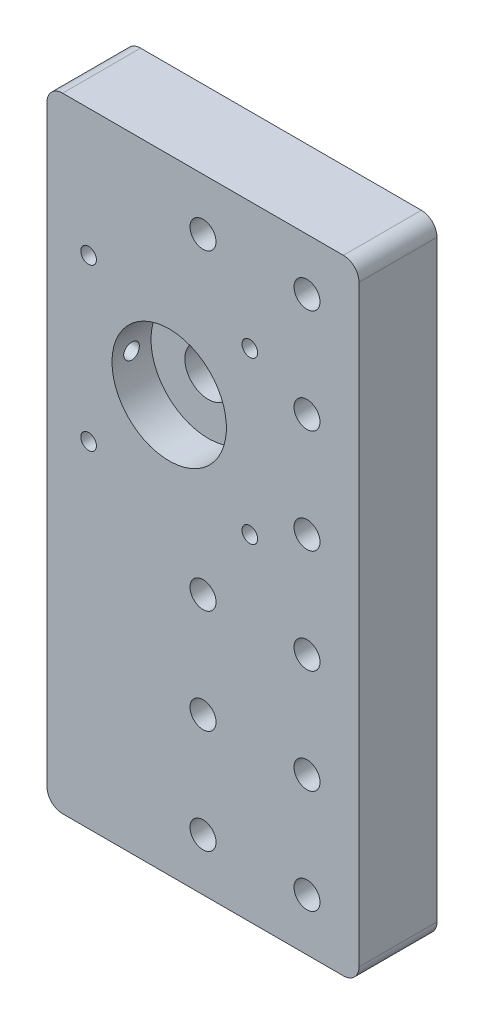
ISO-10303-21;
HEADER;
FILE_DESCRIPTION(('STEP AP214'),'2;1');
FILE_NAME('part.step','',(''),(''),'','','');
FILE_SCHEMA(('AUTOMOTIVE_DESIGN { 1 0 10303 214 1 1 1 1 }'));
ENDSEC;
DATA;
#1=APPLICATION_CONTEXT('core data for automotive mechanical design processes');
#2=APPLICATION_PROTOCOL_DEFINITION('international standard','automotive_design',2000,#1);
#3=PRODUCT_CONTEXT('',#1,'mechanical');
#4=PRODUCT('Part','Part','',(#3));
#5=PRODUCT_RELATED_PRODUCT_CATEGORY('part','',(#4));
#6=PRODUCT_DEFINITION_FORMATION('','',#4);
#7=PRODUCT_DEFINITION_CONTEXT('part definition',#1,'design');
#8=PRODUCT_DEFINITION('design','',#6,#7);
#9=PRODUCT_DEFINITION_SHAPE('','',#8);
#10=(LENGTH_UNIT() NAMED_UNIT(*) SI_UNIT(.MILLI.,.METRE.));
#11=(NAMED_UNIT(*) PLANE_ANGLE_UNIT() SI_UNIT($,.RADIAN.));
#12=(NAMED_UNIT(*) SI_UNIT($,.STERADIAN.) SOLID_ANGLE_UNIT());
#13=UNCERTAINTY_MEASURE_WITH_UNIT(LENGTH_MEASURE(1.E-05),#10,'distance_accuracy_value','');
#14=(GEOMETRIC_REPRESENTATION_CONTEXT(3) GLOBAL_UNCERTAINTY_ASSIGNED_CONTEXT((#13)) GLOBAL_UNIT_ASSIGNED_CONTEXT((#10,
#11,#12)) REPRESENTATION_CONTEXT('',''));
#15=CARTESIAN_POINT('',(0.,0.,0.));
#16=DIRECTION('',(0.,0.,1.));
#17=DIRECTION('',(1.,0.,0.));
#18=AXIS2_PLACEMENT_3D('',#15,#16,#17);
#19=CARTESIAN_POINT('',(83.5,80.,0.));
#20=DIRECTION('',(0.,0.,1.));
#21=DIRECTION('',(-1.,0.,0.));
#22=AXIS2_PLACEMENT_3D('',#19,#20,#21);
#23=CYLINDRICAL_SURFACE('',#22,4.5);
#24=CARTESIAN_POINT('',(83.5,80.,0.));
#25=DIRECTION('',(0.,0.,-1.));
#26=DIRECTION('',(-1.,0.,0.));
#27=AXIS2_PLACEMENT_3D('',#24,#25,#26);
#28=CIRCLE('',#27,4.5);
#29=CARTESIAN_POINT('',(79.,80.,0.));
#30=VERTEX_POINT('',#29);
#31=EDGE_CURVE('E286',#30,#30,#28,.T.);
#32=ORIENTED_EDGE('',*,*,#31,.T.);
#33=EDGE_LOOP('',(#32));
#34=FACE_BOUND('',#33,.T.);
#35=CARTESIAN_POINT('',(83.5,80.,7.5));
#36=DIRECTION('',(0.,0.,-1.));
#37=DIRECTION('',(-1.,0.,0.));
#38=AXIS2_PLACEMENT_3D('',#35,#36,#37);
#39=CIRCLE('',#38,4.5);
#40=CARTESIAN_POINT('',(79.,80.,7.5));
#41=VERTEX_POINT('',#40);
#42=EDGE_CURVE('E330',#41,#41,#39,.T.);
#43=ORIENTED_EDGE('',*,*,#42,.F.);
#44=EDGE_LOOP('',(#43));
#45=FACE_BOUND('',#44,.T.);
#46=ADVANCED_FACE('F39',(#34,#45),#23,.F.);
#47=CARTESIAN_POINT('',(120.,0.,15.));
#48=DIRECTION('',(0.,0.,-1.));
#49=DIRECTION('',(1.,0.,0.));
#50=AXIS2_PLACEMENT_3D('',#47,#48,#49);
#51=PLANE('',#50);
#52=CARTESIAN_POINT('',(83.5,80.,15.));
#53=DIRECTION('',(0.,0.,-1.));
#54=DIRECTION('',(-1.,0.,0.));
#55=AXIS2_PLACEMENT_3D('',#52,#53,#54);
#56=CIRCLE('',#55,11.);
#57=CARTESIAN_POINT('',(72.5,80.,15.));
#58=VERTEX_POINT('',#57);
#59=EDGE_CURVE('E326',#58,#58,#56,.T.);
#60=ORIENTED_EDGE('',*,*,#59,.T.);
#61=EDGE_LOOP('',(#60));
#62=FACE_BOUND('',#61,.T.);
#63=CARTESIAN_POINT('',(99.,64.5,15.));
#64=DIRECTION('',(0.,0.,-1.));
#65=DIRECTION('',(-1.,0.,0.));
#66=AXIS2_PLACEMENT_3D('',#63,#64,#65);
#67=CIRCLE('',#66,1.5);
#68=CARTESIAN_POINT('',(97.5,64.5,15.));
#69=VERTEX_POINT('',#68);
#70=EDGE_CURVE('E298',#69,#69,#67,.T.);
#71=ORIENTED_EDGE('',*,*,#70,.T.);
#72=EDGE_LOOP('',(#71));
#73=FACE_BOUND('',#72,.T.);
#74=CARTESIAN_POINT('',(68.,64.5,15.));
#75=DIRECTION('',(0.,0.,-1.));
#76=DIRECTION('',(-1.,0.,0.));
#77=AXIS2_PLACEMENT_3D('',#74,#75,#76);
#78=CIRCLE('',#77,1.5);
#79=CARTESIAN_POINT('',(66.5,64.5,15.));
#80=VERTEX_POINT('',#79);
#81=EDGE_CURVE('E307',#80,#80,#78,.T.);
#82=ORIENTED_EDGE('',*,*,#81,.T.);
#83=EDGE_LOOP('',(#82));
#84=FACE_BOUND('',#83,.T.);
#85=CARTESIAN_POINT('',(99.,95.5,15.));
#86=DIRECTION('',(0.,0.,-1.));
#87=DIRECTION('',(-1.,0.,0.));
#88=AXIS2_PLACEMENT_3D('',#85,#86,#87);
#89=CIRCLE('',#88,1.5);
#90=CARTESIAN_POINT('',(97.5,95.5,15.));
#91=VERTEX_POINT('',#90);
#92=EDGE_CURVE('E315',#91,#91,#89,.T.);
#93=ORIENTED_EDGE('',*,*,#92,.T.);
#94=EDGE_LOOP('',(#93));
#95=FACE_BOUND('',#94,.T.);
#96=CARTESIAN_POINT('',(68.,95.5,15.));
#97=DIRECTION('',(0.,0.,-1.));
#98=DIRECTION('',(-1.,0.,0.));
#99=AXIS2_PLACEMENT_3D('',#96,#97,#98);
#100=CIRCLE('',#99,1.5);
#101=CARTESIAN_POINT('',(66.5,95.5,15.));
#102=VERTEX_POINT('',#101);
#103=EDGE_CURVE('E293',#102,#102,#100,.T.);
#104=ORIENTED_EDGE('',*,*,#103,.T.);
#105=EDGE_LOOP('',(#104));
#106=FACE_BOUND('',#105,.T.);
#107=DIRECTION('',(0.,-1.,0.));
#108=VECTOR('',#107,1.);
#109=CARTESIAN_POINT('',(120.,0.,15.));
#110=LINE('',#109,#108);
#111=CARTESIAN_POINT('',(120.,117.,15.));
#112=VERTEX_POINT('',#111);
#113=CARTESIAN_POINT('',(120.,3.,15.));
#114=VERTEX_POINT('',#113);
#115=EDGE_CURVE('E148',#112,#114,#110,.T.);
#116=ORIENTED_EDGE('',*,*,#115,.F.);
#117=CARTESIAN_POINT('',(117.,117.,15.));
#118=DIRECTION('',(0.,0.,1.));
#119=DIRECTION('',(1.,0.,0.));
#120=AXIS2_PLACEMENT_3D('',#117,#118,#119);
#121=CIRCLE('',#120,3.);
#122=CARTESIAN_POINT('',(117.,120.,15.));
#123=VERTEX_POINT('',#122);
#124=EDGE_CURVE('E168',#123,#112,#121,.F.);
#125=ORIENTED_EDGE('',*,*,#124,.F.);
#126=DIRECTION('',(1.,0.,0.));
#127=VECTOR('',#126,1.);
#128=CARTESIAN_POINT('',(120.,120.,15.));
#129=LINE('',#128,#127);
#130=CARTESIAN_POINT('',(63.,120.,15.));
#131=VERTEX_POINT('',#130);
#132=EDGE_CURVE('E150',#131,#123,#129,.T.);
#133=ORIENTED_EDGE('',*,*,#132,.F.);
#134=CARTESIAN_POINT('',(63.,117.,15.));
#135=DIRECTION('',(0.,0.,1.));
#136=DIRECTION('',(1.,0.,0.));
#137=AXIS2_PLACEMENT_3D('',#134,#135,#136);
#138=CIRCLE('',#137,3.);
#139=CARTESIAN_POINT('',(60.,117.,15.));
#140=VERTEX_POINT('',#139);
#141=EDGE_CURVE('E165',#140,#131,#138,.F.);
#142=ORIENTED_EDGE('',*,*,#141,.F.);
#143=DIRECTION('',(0.,1.,0.));
#144=VECTOR('',#143,1.);
#145=CARTESIAN_POINT('',(60.,0.,15.));
#146=LINE('',#145,#144);
#147=CARTESIAN_POINT('',(60.,3.,15.));
#148=VERTEX_POINT('',#147);
#149=EDGE_CURVE('E193',#148,#140,#146,.T.);
#150=ORIENTED_EDGE('',*,*,#149,.F.);
#151=CARTESIAN_POINT('',(63.,3.,15.));
#152=DIRECTION('',(0.,0.,1.));
#153=DIRECTION('',(1.,0.,0.));
#154=AXIS2_PLACEMENT_3D('',#151,#152,#153);
#155=CIRCLE('',#154,3.);
#156=CARTESIAN_POINT('',(63.,0.,15.));
#157=VERTEX_POINT('',#156);
#158=EDGE_CURVE('E171',#157,#148,#155,.F.);
#159=ORIENTED_EDGE('',*,*,#158,.F.);
#160=DIRECTION('',(-1.,0.,0.));
#161=VECTOR('',#160,1.);
#162=CARTESIAN_POINT('',(120.,0.,15.));
#163=LINE('',#162,#161);
#164=CARTESIAN_POINT('',(117.,0.,15.));
#165=VERTEX_POINT('',#164);
#166=EDGE_CURVE('E197',#165,#157,#163,.T.);
#167=ORIENTED_EDGE('',*,*,#166,.F.);
#168=CARTESIAN_POINT('',(117.,3.,15.));
#169=DIRECTION('',(0.,0.,1.));
#170=DIRECTION('',(1.,0.,0.));
#171=AXIS2_PLACEMENT_3D('',#168,#169,#170);
#172=CIRCLE('',#171,3.);
#173=EDGE_CURVE('E109',#114,#165,#172,.F.);
#174=ORIENTED_EDGE('',*,*,#173,.F.);
#175=EDGE_LOOP('',(#116,#125,#133,#142,#150,#159,#167,#174));
#176=FACE_BOUND('',#175,.T.);
#177=CARTESIAN_POINT('',(110.,110.,15.));
#178=DIRECTION('',(0.,0.,-1.));
#179=DIRECTION('',(-1.,0.,0.));
#180=AXIS2_PLACEMENT_3D('',#177,#178,#179);
#181=CIRCLE('',#180,2.5);
#182=CARTESIAN_POINT('',(107.5,110.,15.));
#183=VERTEX_POINT('',#182);
#184=EDGE_CURVE('E141',#183,#183,#181,.T.);
#185=ORIENTED_EDGE('',*,*,#184,.T.);
#186=EDGE_LOOP('',(#185));
#187=FACE_BOUND('',#186,.T.);
#188=CARTESIAN_POINT('',(90.,110.,15.));
#189=DIRECTION('',(0.,0.,-1.));
#190=DIRECTION('',(-1.,0.,0.));
#191=AXIS2_PLACEMENT_3D('',#188,#189,#190);
#192=CIRCLE('',#191,2.5);
#193=CARTESIAN_POINT('',(87.5,110.,15.));
#194=VERTEX_POINT('',#193);
#195=EDGE_CURVE('E214',#194,#194,#192,.T.);
#196=ORIENTED_EDGE('',*,*,#195,.T.);
#197=EDGE_LOOP('',(#196));
#198=FACE_BOUND('',#197,.T.);
#199=CARTESIAN_POINT('',(110.,90.,15.));
#200=DIRECTION('',(0.,0.,-1.));
#201=DIRECTION('',(-1.,0.,0.));
#202=AXIS2_PLACEMENT_3D('',#199,#200,#201);
#203=CIRCLE('',#202,2.5);
#204=CARTESIAN_POINT('',(107.5,90.,15.));
#205=VERTEX_POINT('',#204);
#206=EDGE_CURVE('E222',#205,#205,#203,.T.);
#207=ORIENTED_EDGE('',*,*,#206,.T.);
#208=EDGE_LOOP('',(#207));
#209=FACE_BOUND('',#208,.T.);
#210=CARTESIAN_POINT('',(110.,70.,15.));
#211=DIRECTION('',(0.,0.,-1.));
#212=DIRECTION('',(-1.,0.,0.));
#213=AXIS2_PLACEMENT_3D('',#210,#211,#212);
#214=CIRCLE('',#213,2.5);
#215=CARTESIAN_POINT('',(107.5,70.,15.));
#216=VERTEX_POINT('',#215);
#217=EDGE_CURVE('E230',#216,#216,#214,.T.);
#218=ORIENTED_EDGE('',*,*,#217,.T.);
#219=EDGE_LOOP('',(#218));
#220=FACE_BOUND('',#219,.T.);
#221=CARTESIAN_POINT('',(110.,30.,15.));
#222=DIRECTION('',(0.,0.,-1.));
#223=DIRECTION('',(-1.,0.,0.));
#224=AXIS2_PLACEMENT_3D('',#221,#222,#223);
#225=CIRCLE('',#224,2.5);
#226=CARTESIAN_POINT('',(107.5,30.,15.));
#227=VERTEX_POINT('',#226);
#228=EDGE_CURVE('E238',#227,#227,#225,.T.);
#229=ORIENTED_EDGE('',*,*,#228,.T.);
#230=EDGE_LOOP('',(#229));
#231=FACE_BOUND('',#230,.T.);
#232=CARTESIAN_POINT('',(110.,10.,15.));
#233=DIRECTION('',(0.,0.,-1.));
#234=DIRECTION('',(-1.,0.,0.));
#235=AXIS2_PLACEMENT_3D('',#232,#233,#234);
#236=CIRCLE('',#235,2.5);
#237=CARTESIAN_POINT('',(107.5,10.,15.));
#238=VERTEX_POINT('',#237);
#239=EDGE_CURVE('E246',#238,#238,#236,.T.);
#240=ORIENTED_EDGE('',*,*,#239,.T.);
#241=EDGE_LOOP('',(#240));
#242=FACE_BOUND('',#241,.T.);
#243=CARTESIAN_POINT('',(90.,10.,15.));
#244=DIRECTION('',(0.,0.,-1.));
#245=DIRECTION('',(-1.,0.,0.));
#246=AXIS2_PLACEMENT_3D('',#243,#244,#245);
#247=CIRCLE('',#246,2.5);
#248=CARTESIAN_POINT('',(87.5,10.,15.));
#249=VERTEX_POINT('',#248);
#250=EDGE_CURVE('E254',#249,#249,#247,.T.);
#251=ORIENTED_EDGE('',*,*,#250,.T.);
#252=EDGE_LOOP('',(#251));
#253=FACE_BOUND('',#252,.T.);
#254=CARTESIAN_POINT('',(110.,50.,15.));
#255=DIRECTION('',(0.,0.,-1.));
#256=DIRECTION('',(-1.,0.,0.));
#257=AXIS2_PLACEMENT_3D('',#254,#255,#256);
#258=CIRCLE('',#257,2.5);
#259=CARTESIAN_POINT('',(107.5,50.,15.));
#260=VERTEX_POINT('',#259);
#261=EDGE_CURVE('E262',#260,#260,#258,.T.);
#262=ORIENTED_EDGE('',*,*,#261,.T.);
#263=EDGE_LOOP('',(#262));
#264=FACE_BOUND('',#263,.T.);
#265=CARTESIAN_POINT('',(90.,50.,15.));
#266=DIRECTION('',(0.,0.,-1.));
#267=DIRECTION('',(-1.,0.,0.));
#268=AXIS2_PLACEMENT_3D('',#265,#266,#267);
#269=CIRCLE('',#268,2.5);
#270=CARTESIAN_POINT('',(87.5,50.,15.));
#271=VERTEX_POINT('',#270);
#272=EDGE_CURVE('E270',#271,#271,#269,.T.);
#273=ORIENTED_EDGE('',*,*,#272,.T.);
#274=EDGE_LOOP('',(#273));
#275=FACE_BOUND('',#274,.T.);
#276=CARTESIAN_POINT('',(90.,30.,15.));
#277=DIRECTION('',(0.,0.,-1.));
#278=DIRECTION('',(-1.,0.,0.));
#279=AXIS2_PLACEMENT_3D('',#276,#277,#278);
#280=CIRCLE('',#279,2.5);
#281=CARTESIAN_POINT('',(87.5,30.,15.));
#282=VERTEX_POINT('',#281);
#283=EDGE_CURVE('E278',#282,#282,#280,.T.);
#284=ORIENTED_EDGE('',*,*,#283,.T.);
#285=EDGE_LOOP('',(#284));
#286=FACE_BOUND('',#285,.T.);
#287=ADVANCED_FACE('F200',(#62,#73,#84,#95,#106,#176,#187,#198,#209,#220,#231,#242,#253,#264,
#275,#286),#51,.F.);
#288=CARTESIAN_POINT('',(120.,0.,0.));
#289=DIRECTION('',(0.,0.,-1.));
#290=DIRECTION('',(1.,0.,0.));
#291=AXIS2_PLACEMENT_3D('',#288,#289,#290);
#292=PLANE('',#291);
#293=CARTESIAN_POINT('',(99.,64.5,0.));
#294=DIRECTION('',(0.,0.,-1.));
#295=DIRECTION('',(-1.,0.,0.));
#296=AXIS2_PLACEMENT_3D('',#293,#294,#295);
#297=CIRCLE('',#296,1.5);
#298=CARTESIAN_POINT('',(97.5,64.5,0.));
#299=VERTEX_POINT('',#298);
#300=EDGE_CURVE('E294',#299,#299,#297,.T.);
#301=ORIENTED_EDGE('',*,*,#300,.F.);
#302=EDGE_LOOP('',(#301));
#303=FACE_BOUND('',#302,.T.);
#304=CARTESIAN_POINT('',(68.,64.5,0.));
#305=DIRECTION('',(0.,0.,-1.));
#306=DIRECTION('',(-1.,0.,0.));
#307=AXIS2_PLACEMENT_3D('',#304,#305,#306);
#308=CIRCLE('',#307,1.5);
#309=CARTESIAN_POINT('',(66.5,64.5,0.));
#310=VERTEX_POINT('',#309);
#311=EDGE_CURVE('E303',#310,#310,#308,.T.);
#312=ORIENTED_EDGE('',*,*,#311,.F.);
#313=EDGE_LOOP('',(#312));
#314=FACE_BOUND('',#313,.T.);
#315=CARTESIAN_POINT('',(99.,95.5,0.));
#316=DIRECTION('',(0.,0.,-1.));
#317=DIRECTION('',(-1.,0.,0.));
#318=AXIS2_PLACEMENT_3D('',#315,#316,#317);
#319=CIRCLE('',#318,1.5);
#320=CARTESIAN_POINT('',(97.5,95.5,0.));
#321=VERTEX_POINT('',#320);
#322=EDGE_CURVE('E311',#321,#321,#319,.T.);
#323=ORIENTED_EDGE('',*,*,#322,.F.);
#324=EDGE_LOOP('',(#323));
#325=FACE_BOUND('',#324,.T.);
#326=CARTESIAN_POINT('',(68.,95.5,0.));
#327=DIRECTION('',(0.,0.,-1.));
#328=DIRECTION('',(-1.,0.,0.));
#329=AXIS2_PLACEMENT_3D('',#326,#327,#328);
#330=CIRCLE('',#329,1.5);
#331=CARTESIAN_POINT('',(66.5,95.5,0.));
#332=VERTEX_POINT('',#331);
#333=EDGE_CURVE('E319',#332,#332,#330,.T.);
#334=ORIENTED_EDGE('',*,*,#333,.F.);
#335=EDGE_LOOP('',(#334));
#336=FACE_BOUND('',#335,.T.);
#337=ORIENTED_EDGE('',*,*,#31,.F.);
#338=EDGE_LOOP('',(#337));
#339=FACE_BOUND('',#338,.T.);
#340=CARTESIAN_POINT('',(90.,50.,0.));
#341=DIRECTION('',(0.,0.,-1.));
#342=DIRECTION('',(-1.,0.,0.));
#343=AXIS2_PLACEMENT_3D('',#340,#341,#342);
#344=CIRCLE('',#343,2.5);
#345=CARTESIAN_POINT('',(87.5,50.,0.));
#346=VERTEX_POINT('',#345);
#347=EDGE_CURVE('E274',#346,#346,#344,.T.);
#348=ORIENTED_EDGE('',*,*,#347,.F.);
#349=EDGE_LOOP('',(#348));
#350=FACE_BOUND('',#349,.T.);
#351=CARTESIAN_POINT('',(90.,10.,0.));
#352=DIRECTION('',(0.,0.,-1.));
#353=DIRECTION('',(-1.,0.,0.));
#354=AXIS2_PLACEMENT_3D('',#351,#352,#353);
#355=CIRCLE('',#354,2.5);
#356=CARTESIAN_POINT('',(87.5,10.,0.));
#357=VERTEX_POINT('',#356);
#358=EDGE_CURVE('E258',#357,#357,#355,.T.);
#359=ORIENTED_EDGE('',*,*,#358,.F.);
#360=EDGE_LOOP('',(#359));
#361=FACE_BOUND('',#360,.T.);
#362=CARTESIAN_POINT('',(110.,30.,0.));
#363=DIRECTION('',(0.,0.,-1.));
#364=DIRECTION('',(-1.,0.,0.));
#365=AXIS2_PLACEMENT_3D('',#362,#363,#364);
#366=CIRCLE('',#365,2.5);
#367=CARTESIAN_POINT('',(107.5,30.,0.));
#368=VERTEX_POINT('',#367);
#369=EDGE_CURVE('E242',#368,#368,#366,.T.);
#370=ORIENTED_EDGE('',*,*,#369,.F.);
#371=EDGE_LOOP('',(#370));
#372=FACE_BOUND('',#371,.T.);
#373=CARTESIAN_POINT('',(110.,90.,0.));
#374=DIRECTION('',(0.,0.,-1.));
#375=DIRECTION('',(-1.,0.,0.));
#376=AXIS2_PLACEMENT_3D('',#373,#374,#375);
#377=CIRCLE('',#376,2.5);
#378=CARTESIAN_POINT('',(107.5,90.,0.));
#379=VERTEX_POINT('',#378);
#380=EDGE_CURVE('E226',#379,#379,#377,.T.);
#381=ORIENTED_EDGE('',*,*,#380,.F.);
#382=EDGE_LOOP('',(#381));
#383=FACE_BOUND('',#382,.T.);
#384=CARTESIAN_POINT('',(110.,110.,0.));
#385=DIRECTION('',(0.,0.,-1.));
#386=DIRECTION('',(-1.,0.,0.));
#387=AXIS2_PLACEMENT_3D('',#384,#385,#386);
#388=CIRCLE('',#387,2.5);
#389=CARTESIAN_POINT('',(107.5,110.,0.));
#390=VERTEX_POINT('',#389);
#391=EDGE_CURVE('E210',#390,#390,#388,.T.);
#392=ORIENTED_EDGE('',*,*,#391,.F.);
#393=EDGE_LOOP('',(#392));
#394=FACE_BOUND('',#393,.T.);
#395=DIRECTION('',(-1.,0.,0.));
#396=VECTOR('',#395,1.);
#397=CARTESIAN_POINT('',(120.,0.,0.));
#398=LINE('',#397,#396);
#399=CARTESIAN_POINT('',(117.,0.,0.));
#400=VERTEX_POINT('',#399);
#401=CARTESIAN_POINT('',(63.,0.,0.));
#402=VERTEX_POINT('',#401);
#403=EDGE_CURVE('E123',#400,#402,#398,.T.);
#404=ORIENTED_EDGE('',*,*,#403,.T.);
#405=CARTESIAN_POINT('',(63.,3.,0.));
#406=DIRECTION('',(0.,0.,1.));
#407=DIRECTION('',(1.,0.,0.));
#408=AXIS2_PLACEMENT_3D('',#405,#406,#407);
#409=CIRCLE('',#408,3.);
#410=CARTESIAN_POINT('',(60.,3.,0.));
#411=VERTEX_POINT('',#410);
#412=EDGE_CURVE('E129',#411,#402,#409,.T.);
#413=ORIENTED_EDGE('',*,*,#412,.F.);
#414=DIRECTION('',(0.,1.,0.));
#415=VECTOR('',#414,1.);
#416=CARTESIAN_POINT('',(60.,0.,0.));
#417=LINE('',#416,#415);
#418=CARTESIAN_POINT('',(60.,117.,0.));
#419=VERTEX_POINT('',#418);
#420=EDGE_CURVE('E134',#411,#419,#417,.T.);
#421=ORIENTED_EDGE('',*,*,#420,.T.);
#422=CARTESIAN_POINT('',(63.,117.,0.));
#423=DIRECTION('',(0.,0.,1.));
#424=DIRECTION('',(1.,0.,0.));
#425=AXIS2_PLACEMENT_3D('',#422,#423,#424);
#426=CIRCLE('',#425,3.);
#427=CARTESIAN_POINT('',(63.,120.,0.));
#428=VERTEX_POINT('',#427);
#429=EDGE_CURVE('E115',#428,#419,#426,.T.);
#430=ORIENTED_EDGE('',*,*,#429,.F.);
#431=DIRECTION('',(1.,0.,0.));
#432=VECTOR('',#431,1.);
#433=CARTESIAN_POINT('',(120.,120.,0.));
#434=LINE('',#433,#432);
#435=CARTESIAN_POINT('',(117.,120.,0.));
#436=VERTEX_POINT('',#435);
#437=EDGE_CURVE('E139',#428,#436,#434,.T.);
#438=ORIENTED_EDGE('',*,*,#437,.T.);
#439=CARTESIAN_POINT('',(117.,117.,0.));
#440=DIRECTION('',(0.,0.,1.));
#441=DIRECTION('',(1.,0.,0.));
#442=AXIS2_PLACEMENT_3D('',#439,#440,#441);
#443=CIRCLE('',#442,3.);
#444=CARTESIAN_POINT('',(120.,117.,0.));
#445=VERTEX_POINT('',#444);
#446=EDGE_CURVE('E155',#445,#436,#443,.T.);
#447=ORIENTED_EDGE('',*,*,#446,.F.);
#448=DIRECTION('',(0.,-1.,0.));
#449=VECTOR('',#448,1.);
#450=CARTESIAN_POINT('',(120.,0.,0.));
#451=LINE('',#450,#449);
#452=CARTESIAN_POINT('',(120.,3.,0.));
#453=VERTEX_POINT('',#452);
#454=EDGE_CURVE('E126',#445,#453,#451,.T.);
#455=ORIENTED_EDGE('',*,*,#454,.T.);
#456=CARTESIAN_POINT('',(117.,3.,0.));
#457=DIRECTION('',(0.,0.,1.));
#458=DIRECTION('',(1.,0.,0.));
#459=AXIS2_PLACEMENT_3D('',#456,#457,#458);
#460=CIRCLE('',#459,3.);
#461=EDGE_CURVE('E106',#400,#453,#460,.T.);
#462=ORIENTED_EDGE('',*,*,#461,.F.);
#463=EDGE_LOOP('',(#404,#413,#421,#430,#438,#447,#455,#462));
#464=FACE_BOUND('',#463,.T.);
#465=CARTESIAN_POINT('',(90.,110.,0.));
#466=DIRECTION('',(0.,0.,-1.));
#467=DIRECTION('',(-1.,0.,0.));
#468=AXIS2_PLACEMENT_3D('',#465,#466,#467);
#469=CIRCLE('',#468,2.5);
#470=CARTESIAN_POINT('',(87.5,110.,0.));
#471=VERTEX_POINT('',#470);
#472=EDGE_CURVE('E218',#471,#471,#469,.T.);
#473=ORIENTED_EDGE('',*,*,#472,.F.);
#474=EDGE_LOOP('',(#473));
#475=FACE_BOUND('',#474,.T.);
#476=CARTESIAN_POINT('',(110.,70.,0.));
#477=DIRECTION('',(0.,0.,-1.));
#478=DIRECTION('',(-1.,0.,0.));
#479=AXIS2_PLACEMENT_3D('',#476,#477,#478);
#480=CIRCLE('',#479,2.5);
#481=CARTESIAN_POINT('',(107.5,70.,0.));
#482=VERTEX_POINT('',#481);
#483=EDGE_CURVE('E234',#482,#482,#480,.T.);
#484=ORIENTED_EDGE('',*,*,#483,.F.);
#485=EDGE_LOOP('',(#484));
#486=FACE_BOUND('',#485,.T.);
#487=CARTESIAN_POINT('',(110.,10.,0.));
#488=DIRECTION('',(0.,0.,-1.));
#489=DIRECTION('',(-1.,0.,0.));
#490=AXIS2_PLACEMENT_3D('',#487,#488,#489);
#491=CIRCLE('',#490,2.5);
#492=CARTESIAN_POINT('',(107.5,10.,0.));
#493=VERTEX_POINT('',#492);
#494=EDGE_CURVE('E250',#493,#493,#491,.T.);
#495=ORIENTED_EDGE('',*,*,#494,.F.);
#496=EDGE_LOOP('',(#495));
#497=FACE_BOUND('',#496,.T.);
#498=CARTESIAN_POINT('',(110.,50.,0.));
#499=DIRECTION('',(0.,0.,-1.));
#500=DIRECTION('',(-1.,0.,0.));
#501=AXIS2_PLACEMENT_3D('',#498,#499,#500);
#502=CIRCLE('',#501,2.5);
#503=CARTESIAN_POINT('',(107.5,50.,0.));
#504=VERTEX_POINT('',#503);
#505=EDGE_CURVE('E266',#504,#504,#502,.T.);
#506=ORIENTED_EDGE('',*,*,#505,.F.);
#507=EDGE_LOOP('',(#506));
#508=FACE_BOUND('',#507,.T.);
#509=CARTESIAN_POINT('',(90.,30.,0.));
#510=DIRECTION('',(0.,0.,-1.));
#511=DIRECTION('',(-1.,0.,0.));
#512=AXIS2_PLACEMENT_3D('',#509,#510,#511);
#513=CIRCLE('',#512,2.5);
#514=CARTESIAN_POINT('',(87.5,30.,0.));
#515=VERTEX_POINT('',#514);
#516=EDGE_CURVE('E282',#515,#515,#513,.T.);
#517=ORIENTED_EDGE('',*,*,#516,.F.);
#518=EDGE_LOOP('',(#517));
#519=FACE_BOUND('',#518,.T.);
#520=ADVANCED_FACE('F120',(#303,#314,#325,#336,#339,#350,#361,#372,#383,#394,#464,#475,#486,
#497,#508,#519),#292,.T.);
#521=CARTESIAN_POINT('',(120.,0.,15.));
#522=DIRECTION('',(-1.,0.,0.));
#523=DIRECTION('',(0.,0.,-1.));
#524=AXIS2_PLACEMENT_3D('',#521,#522,#523);
#525=PLANE('',#524);
#526=ORIENTED_EDGE('',*,*,#454,.F.);
#527=DIRECTION('',(0.,0.,-1.));
#528=VECTOR('',#527,1.);
#529=CARTESIAN_POINT('',(120.,117.,15.));
#530=LINE('',#529,#528);
#531=EDGE_CURVE('E128',#112,#445,#530,.T.);
#532=ORIENTED_EDGE('',*,*,#531,.F.);
#533=ORIENTED_EDGE('',*,*,#115,.T.);
#534=DIRECTION('',(0.,0.,-1.));
#535=VECTOR('',#534,1.);
#536=CARTESIAN_POINT('',(120.,3.,15.));
#537=LINE('',#536,#535);
#538=EDGE_CURVE('E162',#453,#114,#537,.F.);
#539=ORIENTED_EDGE('',*,*,#538,.F.);
#540=EDGE_LOOP('',(#526,#532,#533,#539));
#541=FACE_BOUND('',#540,.T.);
#542=ADVANCED_FACE('F427',(#541),#525,.F.);
#543=CARTESIAN_POINT('',(120.,0.,15.));
#544=DIRECTION('',(0.,1.,0.));
#545=DIRECTION('',(0.,0.,1.));
#546=AXIS2_PLACEMENT_3D('',#543,#544,#545);
#547=PLANE('',#546);
#548=ORIENTED_EDGE('',*,*,#166,.T.);
#549=DIRECTION('',(0.,0.,-1.));
#550=VECTOR('',#549,1.);
#551=CARTESIAN_POINT('',(63.,0.,15.));
#552=LINE('',#551,#550);
#553=EDGE_CURVE('E116',#402,#157,#552,.F.);
#554=ORIENTED_EDGE('',*,*,#553,.F.);
#555=ORIENTED_EDGE('',*,*,#403,.F.);
#556=DIRECTION('',(0.,0.,-1.));
#557=VECTOR('',#556,1.);
#558=CARTESIAN_POINT('',(117.,0.,15.));
#559=LINE('',#558,#557);
#560=EDGE_CURVE('E103',#165,#400,#559,.T.);
#561=ORIENTED_EDGE('',*,*,#560,.F.);
#562=EDGE_LOOP('',(#548,#554,#555,#561));
#563=FACE_BOUND('',#562,.T.);
#564=ADVANCED_FACE('F131',(#563),#547,.F.);
#565=CARTESIAN_POINT('',(60.,0.,15.));
#566=DIRECTION('',(1.,0.,0.));
#567=DIRECTION('',(0.,0.,1.));
#568=AXIS2_PLACEMENT_3D('',#565,#566,#567);
#569=PLANE('',#568);
#570=CARTESIAN_POINT('',(60.,80.,11.25));
#571=DIRECTION('',(-1.,0.,0.));
#572=DIRECTION('',(0.,0.,1.));
#573=AXIS2_PLACEMENT_3D('',#570,#571,#572);
#574=CIRCLE('',#573,1.5);
#575=CARTESIAN_POINT('',(60.,80.,12.75));
#576=VERTEX_POINT('',#575);
#577=EDGE_CURVE('E331',#576,#576,#574,.T.);
#578=ORIENTED_EDGE('',*,*,#577,.F.);
#579=EDGE_LOOP('',(#578));
#580=FACE_BOUND('',#579,.T.);
#581=ORIENTED_EDGE('',*,*,#149,.T.);
#582=DIRECTION('',(0.,0.,-1.));
#583=VECTOR('',#582,1.);
#584=CARTESIAN_POINT('',(60.,117.,15.));
#585=LINE('',#584,#583);
#586=EDGE_CURVE('E177',#419,#140,#585,.F.);
#587=ORIENTED_EDGE('',*,*,#586,.F.);
#588=ORIENTED_EDGE('',*,*,#420,.F.);
#589=DIRECTION('',(0.,0.,-1.));
#590=VECTOR('',#589,1.);
#591=CARTESIAN_POINT('',(60.,3.,15.));
#592=LINE('',#591,#590);
#593=EDGE_CURVE('E180',#148,#411,#592,.T.);
#594=ORIENTED_EDGE('',*,*,#593,.F.);
#595=EDGE_LOOP('',(#581,#587,#588,#594));
#596=FACE_BOUND('',#595,.T.);
#597=ADVANCED_FACE('F191',(#580,#596),#569,.F.);
#598=CARTESIAN_POINT('',(120.,120.,15.));
#599=DIRECTION('',(0.,-1.,0.));
#600=DIRECTION('',(0.,0.,-1.));
#601=AXIS2_PLACEMENT_3D('',#598,#599,#600);
#602=PLANE('',#601);
#603=ORIENTED_EDGE('',*,*,#437,.F.);
#604=DIRECTION('',(0.,0.,-1.));
#605=VECTOR('',#604,1.);
#606=CARTESIAN_POINT('',(63.,120.,15.));
#607=LINE('',#606,#605);
#608=EDGE_CURVE('E48',#131,#428,#607,.T.);
#609=ORIENTED_EDGE('',*,*,#608,.F.);
#610=ORIENTED_EDGE('',*,*,#132,.T.);
#611=DIRECTION('',(0.,0.,-1.));
#612=VECTOR('',#611,1.);
#613=CARTESIAN_POINT('',(117.,120.,15.));
#614=LINE('',#613,#612);
#615=EDGE_CURVE('E11',#436,#123,#614,.F.);
#616=ORIENTED_EDGE('',*,*,#615,.F.);
#617=EDGE_LOOP('',(#603,#609,#610,#616));
#618=FACE_BOUND('',#617,.T.);
#619=ADVANCED_FACE('F187',(#618),#602,.F.);
#620=CARTESIAN_POINT('',(110.,110.,15.));
#621=DIRECTION('',(0.,0.,-1.));
#622=DIRECTION('',(1.,0.,0.));
#623=AXIS2_PLACEMENT_3D('',#620,#621,#622);
#624=CYLINDRICAL_SURFACE('',#623,2.5);
#625=ORIENTED_EDGE('',*,*,#184,.F.);
#626=EDGE_LOOP('',(#625));
#627=FACE_BOUND('',#626,.T.);
#628=ORIENTED_EDGE('',*,*,#391,.T.);
#629=EDGE_LOOP('',(#628));
#630=FACE_BOUND('',#629,.T.);
#631=ADVANCED_FACE('F417',(#627,#630),#624,.F.);
#632=CARTESIAN_POINT('',(90.,110.,15.));
#633=DIRECTION('',(0.,0.,-1.));
#634=DIRECTION('',(1.,0.,0.));
#635=AXIS2_PLACEMENT_3D('',#632,#633,#634);
#636=CYLINDRICAL_SURFACE('',#635,2.5);
#637=ORIENTED_EDGE('',*,*,#195,.F.);
#638=EDGE_LOOP('',(#637));
#639=FACE_BOUND('',#638,.T.);
#640=ORIENTED_EDGE('',*,*,#472,.T.);
#641=EDGE_LOOP('',(#640));
#642=FACE_BOUND('',#641,.T.);
#643=ADVANCED_FACE('F413',(#639,#642),#636,.F.);
#644=CARTESIAN_POINT('',(110.,90.,15.));
#645=DIRECTION('',(0.,0.,-1.));
#646=DIRECTION('',(1.,0.,0.));
#647=AXIS2_PLACEMENT_3D('',#644,#645,#646);
#648=CYLINDRICAL_SURFACE('',#647,2.5);
#649=ORIENTED_EDGE('',*,*,#206,.F.);
#650=EDGE_LOOP('',(#649));
#651=FACE_BOUND('',#650,.T.);
#652=ORIENTED_EDGE('',*,*,#380,.T.);
#653=EDGE_LOOP('',(#652));
#654=FACE_BOUND('',#653,.T.);
#655=ADVANCED_FACE('F409',(#651,#654),#648,.F.);
#656=CARTESIAN_POINT('',(110.,70.,15.));
#657=DIRECTION('',(0.,0.,-1.));
#658=DIRECTION('',(1.,0.,0.));
#659=AXIS2_PLACEMENT_3D('',#656,#657,#658);
#660=CYLINDRICAL_SURFACE('',#659,2.5);
#661=ORIENTED_EDGE('',*,*,#217,.F.);
#662=EDGE_LOOP('',(#661));
#663=FACE_BOUND('',#662,.T.);
#664=ORIENTED_EDGE('',*,*,#483,.T.);
#665=EDGE_LOOP('',(#664));
#666=FACE_BOUND('',#665,.T.);
#667=ADVANCED_FACE('F405',(#663,#666),#660,.F.);
#668=CARTESIAN_POINT('',(110.,30.,15.));
#669=DIRECTION('',(0.,0.,-1.));
#670=DIRECTION('',(1.,0.,0.));
#671=AXIS2_PLACEMENT_3D('',#668,#669,#670);
#672=CYLINDRICAL_SURFACE('',#671,2.5);
#673=ORIENTED_EDGE('',*,*,#228,.F.);
#674=EDGE_LOOP('',(#673));
#675=FACE_BOUND('',#674,.T.);
#676=ORIENTED_EDGE('',*,*,#369,.T.);
#677=EDGE_LOOP('',(#676));
#678=FACE_BOUND('',#677,.T.);
#679=ADVANCED_FACE('F401',(#675,#678),#672,.F.);
#680=CARTESIAN_POINT('',(110.,10.,15.));
#681=DIRECTION('',(0.,0.,-1.));
#682=DIRECTION('',(1.,0.,0.));
#683=AXIS2_PLACEMENT_3D('',#680,#681,#682);
#684=CYLINDRICAL_SURFACE('',#683,2.5);
#685=ORIENTED_EDGE('',*,*,#239,.F.);
#686=EDGE_LOOP('',(#685));
#687=FACE_BOUND('',#686,.T.);
#688=ORIENTED_EDGE('',*,*,#494,.T.);
#689=EDGE_LOOP('',(#688));
#690=FACE_BOUND('',#689,.T.);
#691=ADVANCED_FACE('F397',(#687,#690),#684,.F.);
#692=CARTESIAN_POINT('',(90.,10.,15.));
#693=DIRECTION('',(0.,0.,-1.));
#694=DIRECTION('',(1.,0.,0.));
#695=AXIS2_PLACEMENT_3D('',#692,#693,#694);
#696=CYLINDRICAL_SURFACE('',#695,2.5);
#697=ORIENTED_EDGE('',*,*,#250,.F.);
#698=EDGE_LOOP('',(#697));
#699=FACE_BOUND('',#698,.T.);
#700=ORIENTED_EDGE('',*,*,#358,.T.);
#701=EDGE_LOOP('',(#700));
#702=FACE_BOUND('',#701,.T.);
#703=ADVANCED_FACE('F393',(#699,#702),#696,.F.);
#704=CARTESIAN_POINT('',(110.,50.,15.));
#705=DIRECTION('',(0.,0.,-1.));
#706=DIRECTION('',(1.,0.,0.));
#707=AXIS2_PLACEMENT_3D('',#704,#705,#706);
#708=CYLINDRICAL_SURFACE('',#707,2.5);
#709=ORIENTED_EDGE('',*,*,#261,.F.);
#710=EDGE_LOOP('',(#709));
#711=FACE_BOUND('',#710,.T.);
#712=ORIENTED_EDGE('',*,*,#505,.T.);
#713=EDGE_LOOP('',(#712));
#714=FACE_BOUND('',#713,.T.);
#715=ADVANCED_FACE('F389',(#711,#714),#708,.F.);
#716=CARTESIAN_POINT('',(90.,50.,15.));
#717=DIRECTION('',(0.,0.,-1.));
#718=DIRECTION('',(1.,0.,0.));
#719=AXIS2_PLACEMENT_3D('',#716,#717,#718);
#720=CYLINDRICAL_SURFACE('',#719,2.5);
#721=ORIENTED_EDGE('',*,*,#272,.F.);
#722=EDGE_LOOP('',(#721));
#723=FACE_BOUND('',#722,.T.);
#724=ORIENTED_EDGE('',*,*,#347,.T.);
#725=EDGE_LOOP('',(#724));
#726=FACE_BOUND('',#725,.T.);
#727=ADVANCED_FACE('F385',(#723,#726),#720,.F.);
#728=CARTESIAN_POINT('',(90.,30.,15.));
#729=DIRECTION('',(0.,0.,-1.));
#730=DIRECTION('',(1.,0.,0.));
#731=AXIS2_PLACEMENT_3D('',#728,#729,#730);
#732=CYLINDRICAL_SURFACE('',#731,2.5);
#733=ORIENTED_EDGE('',*,*,#283,.F.);
#734=EDGE_LOOP('',(#733));
#735=FACE_BOUND('',#734,.T.);
#736=ORIENTED_EDGE('',*,*,#516,.T.);
#737=EDGE_LOOP('',(#736));
#738=FACE_BOUND('',#737,.T.);
#739=ADVANCED_FACE('F382',(#735,#738),#732,.F.);
#740=CARTESIAN_POINT('',(117.,3.,15.));
#741=DIRECTION('',(0.,0.,-1.));
#742=DIRECTION('',(1.,0.,0.));
#743=AXIS2_PLACEMENT_3D('',#740,#741,#742);
#744=CYLINDRICAL_SURFACE('',#743,3.);
#745=ORIENTED_EDGE('',*,*,#173,.T.);
#746=ORIENTED_EDGE('',*,*,#560,.T.);
#747=ORIENTED_EDGE('',*,*,#461,.T.);
#748=ORIENTED_EDGE('',*,*,#538,.T.);
#749=EDGE_LOOP('',(#745,#746,#747,#748));
#750=FACE_BOUND('',#749,.T.);
#751=ADVANCED_FACE('F105',(#750),#744,.T.);
#752=CARTESIAN_POINT('',(63.,3.,15.));
#753=DIRECTION('',(0.,0.,-1.));
#754=DIRECTION('',(1.,0.,0.));
#755=AXIS2_PLACEMENT_3D('',#752,#753,#754);
#756=CYLINDRICAL_SURFACE('',#755,3.);
#757=ORIENTED_EDGE('',*,*,#158,.T.);
#758=ORIENTED_EDGE('',*,*,#593,.T.);
#759=ORIENTED_EDGE('',*,*,#412,.T.);
#760=ORIENTED_EDGE('',*,*,#553,.T.);
#761=EDGE_LOOP('',(#757,#758,#759,#760));
#762=FACE_BOUND('',#761,.T.);
#763=ADVANCED_FACE('F441',(#762),#756,.T.);
#764=CARTESIAN_POINT('',(117.,117.,15.));
#765=DIRECTION('',(0.,0.,-1.));
#766=DIRECTION('',(1.,0.,0.));
#767=AXIS2_PLACEMENT_3D('',#764,#765,#766);
#768=CYLINDRICAL_SURFACE('',#767,3.);
#769=ORIENTED_EDGE('',*,*,#124,.T.);
#770=ORIENTED_EDGE('',*,*,#531,.T.);
#771=ORIENTED_EDGE('',*,*,#446,.T.);
#772=ORIENTED_EDGE('',*,*,#615,.T.);
#773=EDGE_LOOP('',(#769,#770,#771,#772));
#774=FACE_BOUND('',#773,.T.);
#775=ADVANCED_FACE('F443',(#774),#768,.T.);
#776=CARTESIAN_POINT('',(63.,117.,15.));
#777=DIRECTION('',(0.,0.,-1.));
#778=DIRECTION('',(1.,0.,0.));
#779=AXIS2_PLACEMENT_3D('',#776,#777,#778);
#780=CYLINDRICAL_SURFACE('',#779,3.);
#781=ORIENTED_EDGE('',*,*,#141,.T.);
#782=ORIENTED_EDGE('',*,*,#608,.T.);
#783=ORIENTED_EDGE('',*,*,#429,.T.);
#784=ORIENTED_EDGE('',*,*,#586,.T.);
#785=EDGE_LOOP('',(#781,#782,#783,#784));
#786=FACE_BOUND('',#785,.T.);
#787=ADVANCED_FACE('F41',(#786),#780,.T.);
#788=CARTESIAN_POINT('',(68.,95.5,0.));
#789=DIRECTION('',(0.,0.,1.));
#790=DIRECTION('',(-1.,0.,0.));
#791=AXIS2_PLACEMENT_3D('',#788,#789,#790);
#792=CYLINDRICAL_SURFACE('',#791,1.5);
#793=ORIENTED_EDGE('',*,*,#333,.T.);
#794=EDGE_LOOP('',(#793));
#795=FACE_BOUND('',#794,.T.);
#796=ORIENTED_EDGE('',*,*,#103,.F.);
#797=EDGE_LOOP('',(#796));
#798=FACE_BOUND('',#797,.T.);
#799=ADVANCED_FACE('F364',(#795,#798),#792,.F.);
#800=CARTESIAN_POINT('',(99.,95.5,0.));
#801=DIRECTION('',(0.,0.,1.));
#802=DIRECTION('',(-1.,0.,0.));
#803=AXIS2_PLACEMENT_3D('',#800,#801,#802);
#804=CYLINDRICAL_SURFACE('',#803,1.5);
#805=ORIENTED_EDGE('',*,*,#322,.T.);
#806=EDGE_LOOP('',(#805));
#807=FACE_BOUND('',#806,.T.);
#808=ORIENTED_EDGE('',*,*,#92,.F.);
#809=EDGE_LOOP('',(#808));
#810=FACE_BOUND('',#809,.T.);
#811=ADVANCED_FACE('F367',(#807,#810),#804,.F.);
#812=CARTESIAN_POINT('',(68.,64.5,0.));
#813=DIRECTION('',(0.,0.,1.));
#814=DIRECTION('',(-1.,0.,0.));
#815=AXIS2_PLACEMENT_3D('',#812,#813,#814);
#816=CYLINDRICAL_SURFACE('',#815,1.5);
#817=ORIENTED_EDGE('',*,*,#311,.T.);
#818=EDGE_LOOP('',(#817));
#819=FACE_BOUND('',#818,.T.);
#820=ORIENTED_EDGE('',*,*,#81,.F.);
#821=EDGE_LOOP('',(#820));
#822=FACE_BOUND('',#821,.T.);
#823=ADVANCED_FACE('F371',(#819,#822),#816,.F.);
#824=CARTESIAN_POINT('',(99.,64.5,0.));
#825=DIRECTION('',(0.,0.,1.));
#826=DIRECTION('',(-1.,0.,0.));
#827=AXIS2_PLACEMENT_3D('',#824,#825,#826);
#828=CYLINDRICAL_SURFACE('',#827,1.5);
#829=ORIENTED_EDGE('',*,*,#300,.T.);
#830=EDGE_LOOP('',(#829));
#831=FACE_BOUND('',#830,.T.);
#832=ORIENTED_EDGE('',*,*,#70,.F.);
#833=EDGE_LOOP('',(#832));
#834=FACE_BOUND('',#833,.T.);
#835=ADVANCED_FACE('F362',(#831,#834),#828,.F.);
#836=CARTESIAN_POINT('',(83.5,80.,7.5));
#837=DIRECTION('',(0.,0.,1.));
#838=DIRECTION('',(-1.,0.,0.));
#839=AXIS2_PLACEMENT_3D('',#836,#837,#838);
#840=CYLINDRICAL_SURFACE('',#839,11.);
#841=CARTESIAN_POINT('',(72.5,80.,12.75));
#842=CARTESIAN_POINT('',(72.5000012532738,79.9161615865701,12.7499964805426));
#843=CARTESIAN_POINT('',(72.5009685728512,79.8322723977103,12.7429474073274));
#844=CARTESIAN_POINT('',(72.5047343359155,79.6668329023586,12.7149411167757));
#845=CARTESIAN_POINT('',(72.507534635599,79.5852850543401,12.6939698005502));
#846=CARTESIAN_POINT('',(72.5146512260171,79.4269469063064,12.6387522661594));
#847=CARTESIAN_POINT('',(72.5189664416081,79.3501532775468,12.6045154607979));
#848=CARTESIAN_POINT('',(72.528634272777,79.2034146975503,12.5237604754398));
#849=CARTESIAN_POINT('',(72.5339867250994,79.1334686711413,12.4772442277457));
#850=CARTESIAN_POINT('',(72.5451714003075,79.0019424361877,12.3729277857077));
#851=CARTESIAN_POINT('',(72.5510062309478,78.9404132153762,12.3150635769965));
#852=CARTESIAN_POINT('',(72.5624772844068,78.8279066609195,12.1898313892076));
#853=CARTESIAN_POINT('',(72.5681134965475,78.776929893872,12.1224629001387));
#854=CARTESIAN_POINT('',(72.5785746222812,78.6867814947507,11.9797980617759));
#855=CARTESIAN_POINT('',(72.583396169892,78.647658335316,11.9044708149948));
#856=CARTESIAN_POINT('',(72.5916470593224,78.5826373551472,11.7482381846263));
#857=CARTESIAN_POINT('',(72.595076463827,78.5567389389201,11.6673330523902));
#858=CARTESIAN_POINT('',(72.6001295030783,78.5190590944491,11.5027737564264));
#859=CARTESIAN_POINT('',(72.6017642177551,78.5071910113545,11.4191397807089));
#860=CARTESIAN_POINT('',(72.6030765619518,78.4976404494033,11.2510525269759));
#861=CARTESIAN_POINT('',(72.6027542846692,78.4999572950202,11.1665992881672));
#862=CARTESIAN_POINT('',(72.6001991966344,78.5186398298076,10.9998782743991));
#863=CARTESIAN_POINT('',(72.5979794289804,78.5349096108241,10.9175995236328));
#864=CARTESIAN_POINT('',(72.5918998259182,78.580886323047,10.7569509594673));
#865=CARTESIAN_POINT('',(72.588039951545,78.6105935734975,10.678581238987));
#866=CARTESIAN_POINT('',(72.579100417063,78.6827035823979,10.5276800739624));
#867=CARTESIAN_POINT('',(72.5740168072425,78.7251475614224,10.455168570732));
#868=CARTESIAN_POINT('',(72.5632055566531,78.8214967695518,10.3182608511142));
#869=CARTESIAN_POINT('',(72.5574778808782,78.8754026217696,10.2538650762333));
#870=CARTESIAN_POINT('',(72.545966026102,78.993674722162,10.1344604455054));
#871=CARTESIAN_POINT('',(72.5401817705892,79.0581235492658,10.0795333596876));
#872=CARTESIAN_POINT('',(72.5292525294221,79.1953690555946,9.98126350840162));
#873=CARTESIAN_POINT('',(72.5241075457602,79.2681657608354,9.93792077903695));
#874=CARTESIAN_POINT('',(72.5150324591229,79.4201070305195,9.86404813681997));
#875=CARTESIAN_POINT('',(72.5111028905153,79.4992543678687,9.83352385760728));
#876=CARTESIAN_POINT('',(72.5049060479693,79.6616169120601,9.7862221620544));
#877=CARTESIAN_POINT('',(72.502638681308,79.7448318917199,9.76944397890651));
#878=CARTESIAN_POINT('',(72.5000338619625,79.9122610926323,9.75021791543442));
#879=CARTESIAN_POINT('',(72.4996812530986,79.9964621636121,9.74765749141139));
#880=CARTESIAN_POINT('',(72.5009046122902,80.1640922940892,9.75664187833073));
#881=CARTESIAN_POINT('',(72.5024805312617,80.2475213731804,9.76818633028291));
#882=CARTESIAN_POINT('',(72.5073744734208,80.4109033783649,9.80495922320966));
#883=CARTESIAN_POINT('',(72.5106855987668,80.4908687206206,9.83013349557132));
#884=CARTESIAN_POINT('',(72.5186795593637,80.6454431410956,9.89339475903291));
#885=CARTESIAN_POINT('',(72.5233624490969,80.7200520064252,9.93148226301717));
#886=CARTESIAN_POINT('',(72.5336163696397,80.8622948929824,10.019757538724));
#887=CARTESIAN_POINT('',(72.539192629429,80.9298837283532,10.0700175028004));
#888=CARTESIAN_POINT('',(72.5505944685733,81.0557070132546,10.1811095779574));
#889=CARTESIAN_POINT('',(72.5564200597808,81.1139410174533,10.2419421920567));
#890=CARTESIAN_POINT('',(72.5677113122697,81.2198053295411,10.3729508330084));
#891=CARTESIAN_POINT('',(72.5731742498786,81.2673606638064,10.4431877134811));
#892=CARTESIAN_POINT('',(72.5830753495584,81.3499983954926,10.5907183076998));
#893=CARTESIAN_POINT('',(72.5875135353765,81.3850810819614,10.6680118578586));
#894=CARTESIAN_POINT('',(72.5948435273933,81.4416584950515,10.8272277566732));
#895=CARTESIAN_POINT('',(72.597740001028,81.4631942705001,10.9091352944361));
#896=CARTESIAN_POINT('',(72.6016715683977,81.4921981054752,11.075446521828));
#897=CARTESIAN_POINT('',(72.6027067666591,81.499666954979,11.1598500710143));
#898=CARTESIAN_POINT('',(72.6027951458473,81.5003085658472,11.328010975391));
#899=CARTESIAN_POINT('',(72.6018646613795,81.4935991469064,11.4117678966084));
#900=CARTESIAN_POINT('',(72.5981617994635,81.4663254643853,11.5769511386985));
#901=CARTESIAN_POINT('',(72.5953894230665,81.4457612087119,11.6583774609012));
#902=CARTESIAN_POINT('',(72.5883204918021,81.3914005645048,11.8165651393851));
#903=CARTESIAN_POINT('',(72.5840247196071,81.3576109698069,11.8933288674825));
#904=CARTESIAN_POINT('',(72.574391888755,81.2777703983912,12.0401162986064));
#905=CARTESIAN_POINT('',(72.5690548073377,81.2317191536582,12.1101398542605));
#906=CARTESIAN_POINT('',(72.5578877007815,81.1282291522308,12.2420600365998));
#907=CARTESIAN_POINT('',(72.5520540943964,81.070702784234,12.3038876362225));
#908=CARTESIAN_POINT('',(72.5405821269644,80.9460798680536,12.4170553467108));
#909=CARTESIAN_POINT('',(72.5349438119584,80.8789810819578,12.4683929983114));
#910=CARTESIAN_POINT('',(72.5244690703008,80.736765493202,12.5593259673834));
#911=CARTESIAN_POINT('',(72.5196363835438,80.6616138185173,12.5988671582763));
#912=CARTESIAN_POINT('',(72.5113546294284,80.5057096939303,12.664709481053));
#913=CARTESIAN_POINT('',(72.5079040897228,80.4249633120219,12.6910247096937));
#914=CARTESIAN_POINT('',(72.5035882393269,80.2865185970872,12.7235104370639));
#915=CARTESIAN_POINT('',(72.5022493572114,80.229685788696,12.7334293607973));
#916=CARTESIAN_POINT('',(72.5004548109262,80.1152433136469,12.7466753209812));
#917=CARTESIAN_POINT('',(72.4999991384528,80.0576336542977,12.7500024194064));
#918=CARTESIAN_POINT('',(72.5,80.,12.75));
#919=B_SPLINE_CURVE_WITH_KNOTS('',3,(#841,#842,#843,#844,#845,#846,#847,#848,#849,#850,#851,
#852,#853,#854,#855,#856,#857,#858,#859,#860,#861,#862,#863,#864,#865,#866,#867,#868,#869,#870,
#871,#872,#873,#874,#875,#876,#877,#878,#879,#880,#881,#882,#883,#884,#885,#886,#887,#888,#889,
#890,#891,#892,#893,#894,#895,#896,#897,#898,#899,#900,#901,#902,#903,#904,#905,#906,#907,#908,
#909,#910,#911,#912,#913,#914,#915,#916,#917,#918),.UNSPECIFIED.,.T.,.F.,(4,2,2,2,2,2,2,2,2,2,2,
2,2,2,2,2,2,2,2,2,2,2,2,2,2,2,2,2,2,2,2,2,2,2,2,2,2,2,4),(0.,0.25130468808613,0.502864258429492,
0.754245655375313,1.00558751830525,1.25839025869504,1.51120656941611,1.76504317927172,
2.01886835818389,2.27111752000617,2.52335466910191,2.77387178872724,3.02439486038875,
3.27573762185035,3.52709405079555,3.78052284746839,4.0339524339601,4.28749328511461,
4.54101999186669,4.79253696204824,5.0440475308801,5.29456578809545,5.54509399649482,
5.79714607697892,6.04921015271755,6.30299215129409,6.5567682682073,6.80977166004952,
7.0627608431786,7.3136559874506,7.56455098853992,7.81531727406241,8.0660890412842,
8.31885423544368,8.5716786200941,8.82564582024678,9.0793417549426,9.25209960062626,
9.42485582207674),.UNSPECIFIED.);
#920=CARTESIAN_POINT('',(72.5,80.,12.75));
#921=VERTEX_POINT('',#920);
#922=EDGE_CURVE('E341',#921,#921,#919,.T.);
#923=ORIENTED_EDGE('',*,*,#922,.F.);
#924=EDGE_LOOP('',(#923));
#925=FACE_BOUND('',#924,.T.);
#926=CARTESIAN_POINT('',(83.5,80.,7.5));
#927=DIRECTION('',(0.,0.,-1.));
#928=DIRECTION('',(-1.,0.,0.));
#929=AXIS2_PLACEMENT_3D('',#926,#927,#928);
#930=CIRCLE('',#929,11.);
#931=CARTESIAN_POINT('',(72.5,80.,7.5));
#932=VERTEX_POINT('',#931);
#933=EDGE_CURVE('E299',#932,#932,#930,.T.);
#934=ORIENTED_EDGE('',*,*,#933,.T.);
#935=EDGE_LOOP('',(#934));
#936=FACE_BOUND('',#935,.T.);
#937=ORIENTED_EDGE('',*,*,#59,.F.);
#938=EDGE_LOOP('',(#937));
#939=FACE_BOUND('',#938,.T.);
#940=ADVANCED_FACE('F358',(#925,#936,#939),#840,.F.);
#941=CARTESIAN_POINT('',(120.,0.,7.5));
#942=DIRECTION('',(0.,0.,1.));
#943=DIRECTION('',(-1.,0.,0.));
#944=AXIS2_PLACEMENT_3D('',#941,#942,#943);
#945=PLANE('',#944);
#946=ORIENTED_EDGE('',*,*,#42,.T.);
#947=EDGE_LOOP('',(#946));
#948=FACE_BOUND('',#947,.T.);
#949=ORIENTED_EDGE('',*,*,#933,.F.);
#950=EDGE_LOOP('',(#949));
#951=FACE_BOUND('',#950,.T.);
#952=ADVANCED_FACE('F354',(#948,#951),#945,.T.);
#953=CARTESIAN_POINT('',(120.001,80.,11.25));
#954=DIRECTION('',(-1.,0.,0.));
#955=DIRECTION('',(0.,0.,1.));
#956=AXIS2_PLACEMENT_3D('',#953,#954,#955);
#957=CYLINDRICAL_SURFACE('',#956,1.5);
#958=ORIENTED_EDGE('',*,*,#577,.T.);
#959=EDGE_LOOP('',(#958));
#960=FACE_BOUND('',#959,.T.);
#961=ORIENTED_EDGE('',*,*,#922,.T.);
#962=EDGE_LOOP('',(#961));
#963=FACE_BOUND('',#962,.T.);
#964=ADVANCED_FACE('F349',(#960,#963),#957,.F.);
#965=CLOSED_SHELL('',(#46,#287,#520,#542,#564,#597,#619,#631,#643,#655,#667,#679,#691,#703,#715,
#727,#739,#751,#763,#775,#787,#799,#811,#823,#835,#940,#952,#964));
#966=MANIFOLD_SOLID_BREP('B2',#965);
#967=ADVANCED_BREP_SHAPE_REPRESENTATION('',(#18,#966),#14);
#968=SHAPE_DEFINITION_REPRESENTATION(#9,#967);
ENDSEC;
END-ISO-10303-21;
